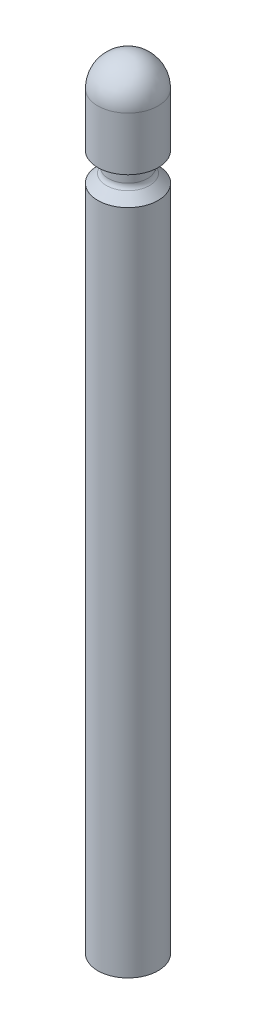
ISO-10303-21;
HEADER;
FILE_DESCRIPTION(('STEP AP214'),'2;1');
FILE_NAME('part.step','',(''),(''),'','','');
FILE_SCHEMA(('AUTOMOTIVE_DESIGN { 1 0 10303 214 1 1 1 1 }'));
ENDSEC;
DATA;
#1=APPLICATION_CONTEXT('core data for automotive mechanical design processes');
#2=APPLICATION_PROTOCOL_DEFINITION('international standard','automotive_design',2000,#1);
#3=PRODUCT_CONTEXT('',#1,'mechanical');
#4=PRODUCT('Part','Part','',(#3));
#5=PRODUCT_RELATED_PRODUCT_CATEGORY('part','',(#4));
#6=PRODUCT_DEFINITION_FORMATION('','',#4);
#7=PRODUCT_DEFINITION_CONTEXT('part definition',#1,'design');
#8=PRODUCT_DEFINITION('design','',#6,#7);
#9=PRODUCT_DEFINITION_SHAPE('','',#8);
#10=(LENGTH_UNIT() NAMED_UNIT(*) SI_UNIT(.MILLI.,.METRE.));
#11=(NAMED_UNIT(*) PLANE_ANGLE_UNIT() SI_UNIT($,.RADIAN.));
#12=(NAMED_UNIT(*) SI_UNIT($,.STERADIAN.) SOLID_ANGLE_UNIT());
#13=UNCERTAINTY_MEASURE_WITH_UNIT(LENGTH_MEASURE(1.E-05),#10,'distance_accuracy_value','');
#14=(GEOMETRIC_REPRESENTATION_CONTEXT(3) GLOBAL_UNCERTAINTY_ASSIGNED_CONTEXT((#13)) GLOBAL_UNIT_ASSIGNED_CONTEXT((#10,
#11,#12)) REPRESENTATION_CONTEXT('',''));
#15=CARTESIAN_POINT('',(0.,0.,0.));
#16=DIRECTION('',(0.,0.,1.));
#17=DIRECTION('',(1.,0.,0.));
#18=AXIS2_PLACEMENT_3D('',#15,#16,#17);
#19=CARTESIAN_POINT('',(0.,86.91372,0.));
#20=DIRECTION('',(0.,-1.,0.));
#21=DIRECTION('',(0.,0.,-1.));
#22=AXIS2_PLACEMENT_3D('',#19,#20,#21);
#23=CYLINDRICAL_SURFACE('',#22,3.3655);
#24=CARTESIAN_POINT('',(0.,74.41946,0.));
#25=DIRECTION('',(0.,1.,0.));
#26=DIRECTION('',(-1.,0.,0.));
#27=AXIS2_PLACEMENT_3D('',#24,#25,#26);
#28=CIRCLE('',#27,3.3655);
#29=CARTESIAN_POINT('',(-3.3655,74.41946,0.));
#30=VERTEX_POINT('',#29);
#31=EDGE_CURVE('E49',#30,#30,#28,.T.);
#32=ORIENTED_EDGE('',*,*,#31,.F.);
#33=EDGE_LOOP('',(#32));
#34=FACE_BOUND('',#33,.T.);
#35=CARTESIAN_POINT('',(0.,0.,0.));
#36=DIRECTION('',(0.,1.,0.));
#37=DIRECTION('',(0.,0.,1.));
#38=AXIS2_PLACEMENT_3D('',#35,#36,#37);
#39=CIRCLE('',#38,3.3655);
#40=CARTESIAN_POINT('',(0.,0.,3.3655));
#41=VERTEX_POINT('',#40);
#42=EDGE_CURVE('E45',#41,#41,#39,.T.);
#43=ORIENTED_EDGE('',*,*,#42,.T.);
#44=EDGE_LOOP('',(#43));
#45=FACE_BOUND('',#44,.T.);
#46=ADVANCED_FACE('F38',(#34,#45),#23,.T.);
#47=CARTESIAN_POINT('',(0.,0.,0.));
#48=DIRECTION('',(0.,1.,0.));
#49=DIRECTION('',(0.,0.,1.));
#50=AXIS2_PLACEMENT_3D('',#47,#48,#49);
#51=PLANE('',#50);
#52=ORIENTED_EDGE('',*,*,#42,.F.);
#53=EDGE_LOOP('',(#52));
#54=FACE_BOUND('',#53,.T.);
#55=ADVANCED_FACE('F100',(#54),#51,.F.);
#56=CARTESIAN_POINT('',(0.,74.41946,0.));
#57=DIRECTION('',(0.,-1.,0.));
#58=DIRECTION('',(1.,0.,0.));
#59=AXIS2_PLACEMENT_3D('',#56,#57,#58);
#60=CONICAL_SURFACE('',#59,3.3655,0.785398163397449);
#61=CARTESIAN_POINT('',(0.,75.3776010075668,0.));
#62=DIRECTION('',(0.,1.,0.));
#63=DIRECTION('',(-1.,0.,0.));
#64=AXIS2_PLACEMENT_3D('',#61,#62,#63);
#65=CIRCLE('',#64,2.40735899243318);
#66=CARTESIAN_POINT('',(-2.40735899243318,75.3776010075668,0.));
#67=VERTEX_POINT('',#66);
#68=EDGE_CURVE('E53',#67,#67,#65,.T.);
#69=ORIENTED_EDGE('',*,*,#68,.F.);
#70=EDGE_LOOP('',(#69));
#71=FACE_BOUND('',#70,.T.);
#72=ORIENTED_EDGE('',*,*,#31,.T.);
#73=EDGE_LOOP('',(#72));
#74=FACE_BOUND('',#73,.T.);
#75=ADVANCED_FACE('F94',(#71,#74),#60,.T.);
#76=CARTESIAN_POINT('',(0.,75.9388670151337,0.));
#77=DIRECTION('',(0.,1.,0.));
#78=DIRECTION('',(-1.,0.,0.));
#79=AXIS2_PLACEMENT_3D('',#76,#77,#78);
#80=TOROIDAL_SURFACE('',#79,2.96862499999999,0.793749999999999);
#81=CARTESIAN_POINT('',(0.,75.9388670151337,0.));
#82=DIRECTION('',(0.,1.,0.));
#83=DIRECTION('',(-1.,0.,0.));
#84=AXIS2_PLACEMENT_3D('',#81,#82,#83);
#85=CIRCLE('',#84,2.174875);
#86=CARTESIAN_POINT('',(-2.174875,75.9388670151337,0.));
#87=VERTEX_POINT('',#86);
#88=EDGE_CURVE('E58',#87,#87,#85,.T.);
#89=ORIENTED_EDGE('',*,*,#88,.F.);
#90=EDGE_LOOP('',(#89));
#91=FACE_BOUND('',#90,.T.);
#92=ORIENTED_EDGE('',*,*,#68,.T.);
#93=EDGE_LOOP('',(#92));
#94=FACE_BOUND('',#93,.T.);
#95=ADVANCED_FACE('F88',(#91,#94),#80,.F.);
#96=CARTESIAN_POINT('',(0.,86.91372,0.));
#97=DIRECTION('',(0.,1.,0.));
#98=DIRECTION('',(-1.,0.,0.));
#99=AXIS2_PLACEMENT_3D('',#96,#97,#98);
#100=CYLINDRICAL_SURFACE('',#99,2.174875);
#101=CARTESIAN_POINT('',(0.,76.80071,0.));
#102=DIRECTION('',(0.,1.,0.));
#103=DIRECTION('',(-1.,0.,0.));
#104=AXIS2_PLACEMENT_3D('',#101,#102,#103);
#105=CIRCLE('',#104,2.174875);
#106=CARTESIAN_POINT('',(-2.17487500000001,76.80071,0.));
#107=VERTEX_POINT('',#106);
#108=EDGE_CURVE('E61',#107,#107,#105,.T.);
#109=ORIENTED_EDGE('',*,*,#108,.F.);
#110=EDGE_LOOP('',(#109));
#111=FACE_BOUND('',#110,.T.);
#112=ORIENTED_EDGE('',*,*,#88,.T.);
#113=EDGE_LOOP('',(#112));
#114=FACE_BOUND('',#113,.T.);
#115=ADVANCED_FACE('F82',(#111,#114),#100,.T.);
#116=CARTESIAN_POINT('',(0.,76.80071,0.));
#117=DIRECTION('',(0.,1.,0.));
#118=DIRECTION('',(-1.,0.,0.));
#119=AXIS2_PLACEMENT_3D('',#116,#117,#118);
#120=TOROIDAL_SURFACE('',#119,2.96862499999999,0.793749999999992);
#121=CARTESIAN_POINT('',(0.,77.59446,0.));
#122=DIRECTION('',(0.,1.,0.));
#123=DIRECTION('',(-1.,0.,0.));
#124=AXIS2_PLACEMENT_3D('',#121,#122,#123);
#125=CIRCLE('',#124,2.96862499999999);
#126=CARTESIAN_POINT('',(-2.968625,77.59446,0.));
#127=VERTEX_POINT('',#126);
#128=EDGE_CURVE('E64',#127,#127,#125,.T.);
#129=ORIENTED_EDGE('',*,*,#128,.F.);
#130=EDGE_LOOP('',(#129));
#131=FACE_BOUND('',#130,.T.);
#132=ORIENTED_EDGE('',*,*,#108,.T.);
#133=EDGE_LOOP('',(#132));
#134=FACE_BOUND('',#133,.T.);
#135=ADVANCED_FACE('F76',(#131,#134),#120,.F.);
#136=CARTESIAN_POINT('',(-3.25755295339229,77.59446,0.845540658895338));
#137=DIRECTION('',(0.,1.,0.));
#138=DIRECTION('',(-1.,0.,0.));
#139=AXIS2_PLACEMENT_3D('',#136,#137,#138);
#140=PLANE('',#139);
#141=CARTESIAN_POINT('',(0.,77.59446,0.));
#142=DIRECTION('',(0.,1.,0.));
#143=DIRECTION('',(-1.,0.,0.));
#144=AXIS2_PLACEMENT_3D('',#141,#142,#143);
#145=CIRCLE('',#144,3.36549999999999);
#146=CARTESIAN_POINT('',(-3.3655,77.59446,0.));
#147=VERTEX_POINT('',#146);
#148=EDGE_CURVE('E67',#147,#147,#145,.T.);
#149=ORIENTED_EDGE('',*,*,#148,.F.);
#150=EDGE_LOOP('',(#149));
#151=FACE_BOUND('',#150,.T.);
#152=ORIENTED_EDGE('',*,*,#128,.T.);
#153=EDGE_LOOP('',(#152));
#154=FACE_BOUND('',#153,.T.);
#155=ADVANCED_FACE('F73',(#151,#154),#140,.F.);
#156=CARTESIAN_POINT('',(0.,83.54822,0.));
#157=DIRECTION('',(0.,-1.,0.));
#158=DIRECTION('',(0.,0.,-1.));
#159=AXIS2_PLACEMENT_3D('',#156,#157,#158);
#160=CIRCLE('',#159,3.3655);
#161=CARTESIAN_POINT('',(0.,83.54822,-3.3655));
#162=VERTEX_POINT('',#161);
#163=EDGE_CURVE('E10',#162,#162,#160,.T.);
#164=ORIENTED_EDGE('',*,*,#163,.T.);
#165=EDGE_LOOP('',(#164));
#166=FACE_BOUND('',#165,.T.);
#167=ORIENTED_EDGE('',*,*,#148,.T.);
#168=EDGE_LOOP('',(#167));
#169=FACE_BOUND('',#168,.T.);
#170=ADVANCED_FACE('F71',(#166,#169),#23,.T.);
#171=CARTESIAN_POINT('',(0.,83.54822,0.));
#172=DIRECTION('',(0.,1.,0.));
#173=DIRECTION('',(0.,0.,1.));
#174=AXIS2_PLACEMENT_3D('',#171,#172,#173);
#175=SPHERICAL_SURFACE('',#174,3.3655);
#176=ORIENTED_EDGE('',*,*,#163,.F.);
#177=EDGE_LOOP('',(#176));
#178=FACE_BOUND('',#177,.T.);
#179=ADVANCED_FACE('F40',(#178),#175,.T.);
#180=CLOSED_SHELL('',(#46,#55,#75,#95,#115,#135,#155,#170,#179));
#181=MANIFOLD_SOLID_BREP('B2',#180);
#182=ADVANCED_BREP_SHAPE_REPRESENTATION('',(#18,#181),#14);
#183=SHAPE_DEFINITION_REPRESENTATION(#9,#182);
ENDSEC;
END-ISO-10303-21;
